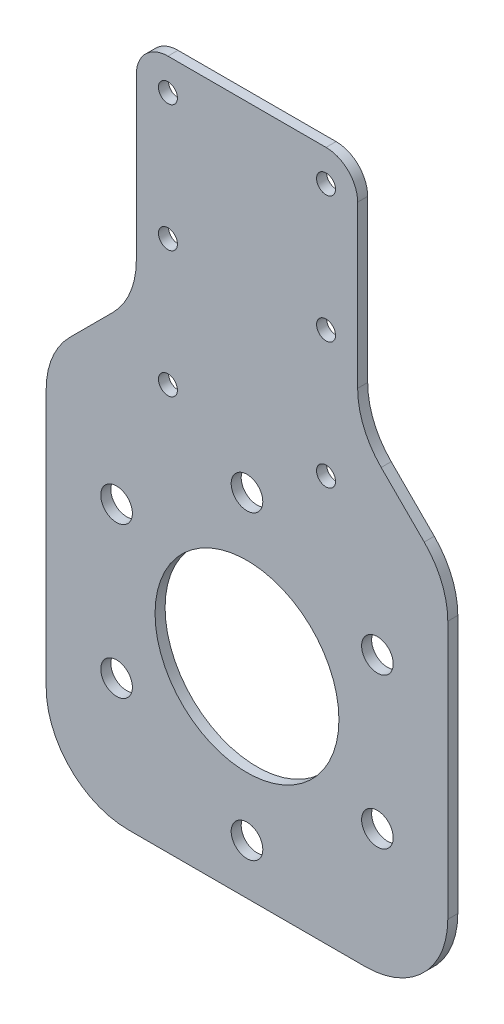
ISO-10303-21;
HEADER;
FILE_DESCRIPTION(('STEP AP214'),'2;1');
FILE_NAME('part.step','',(''),(''),'','','');
FILE_SCHEMA(('AUTOMOTIVE_DESIGN { 1 0 10303 214 1 1 1 1 }'));
ENDSEC;
DATA;
#1=APPLICATION_CONTEXT('core data for automotive mechanical design processes');
#2=APPLICATION_PROTOCOL_DEFINITION('international standard','automotive_design',2000,#1);
#3=PRODUCT_CONTEXT('',#1,'mechanical');
#4=PRODUCT('Part','Part','',(#3));
#5=PRODUCT_RELATED_PRODUCT_CATEGORY('part','',(#4));
#6=PRODUCT_DEFINITION_FORMATION('','',#4);
#7=PRODUCT_DEFINITION_CONTEXT('part definition',#1,'design');
#8=PRODUCT_DEFINITION('design','',#6,#7);
#9=PRODUCT_DEFINITION_SHAPE('','',#8);
#10=(LENGTH_UNIT() NAMED_UNIT(*) SI_UNIT(.MILLI.,.METRE.));
#11=(NAMED_UNIT(*) PLANE_ANGLE_UNIT() SI_UNIT($,.RADIAN.));
#12=(NAMED_UNIT(*) SI_UNIT($,.STERADIAN.) SOLID_ANGLE_UNIT());
#13=UNCERTAINTY_MEASURE_WITH_UNIT(LENGTH_MEASURE(1.E-05),#10,'distance_accuracy_value','');
#14=(GEOMETRIC_REPRESENTATION_CONTEXT(3) GLOBAL_UNCERTAINTY_ASSIGNED_CONTEXT((#13)) GLOBAL_UNIT_ASSIGNED_CONTEXT((#10,
#11,#12)) REPRESENTATION_CONTEXT('',''));
#15=CARTESIAN_POINT('',(0.,0.,0.));
#16=DIRECTION('',(0.,0.,1.));
#17=DIRECTION('',(1.,0.,0.));
#18=AXIS2_PLACEMENT_3D('',#15,#16,#17);
#19=CARTESIAN_POINT('',(0.,0.,1.5875));
#20=DIRECTION('',(0.,0.,1.));
#21=DIRECTION('',(1.,0.,0.));
#22=AXIS2_PLACEMENT_3D('',#19,#20,#21);
#23=PLANE('',#22);
#24=CARTESIAN_POINT('',(52.3722299276169,-15.4307500000005,1.5875));
#25=DIRECTION('',(0.,0.,1.));
#26=DIRECTION('',(1.,0.,0.));
#27=AXIS2_PLACEMENT_3D('',#24,#25,#26);
#28=CIRCLE('',#27,2.5);
#29=CARTESIAN_POINT('',(54.8722299276169,-15.4307500000005,1.5875));
#30=VERTEX_POINT('',#29);
#31=EDGE_CURVE('E424',#30,#30,#28,.T.);
#32=ORIENTED_EDGE('',*,*,#31,.F.);
#33=EDGE_LOOP('',(#32));
#34=FACE_BOUND('',#33,.T.);
#35=CARTESIAN_POINT('',(11.1277700723835,-15.4307500000003,1.5875));
#36=DIRECTION('',(0.,0.,1.));
#37=DIRECTION('',(1.,0.,0.));
#38=AXIS2_PLACEMENT_3D('',#35,#36,#37);
#39=CIRCLE('',#38,2.5);
#40=CARTESIAN_POINT('',(13.6277700723835,-15.4307500000003,1.5875));
#41=VERTEX_POINT('',#40);
#42=EDGE_CURVE('E408',#41,#41,#39,.T.);
#43=ORIENTED_EDGE('',*,*,#42,.F.);
#44=EDGE_LOOP('',(#43));
#45=FACE_BOUND('',#44,.T.);
#46=CARTESIAN_POINT('',(44.25,45.,1.5875));
#47=DIRECTION('',(0.,0.,1.));
#48=DIRECTION('',(-1.,0.,0.));
#49=AXIS2_PLACEMENT_3D('',#46,#47,#48);
#50=CIRCLE('',#49,1.5);
#51=CARTESIAN_POINT('',(42.75,45.,1.5875));
#52=VERTEX_POINT('',#51);
#53=EDGE_CURVE('E392',#52,#52,#50,.T.);
#54=ORIENTED_EDGE('',*,*,#53,.F.);
#55=EDGE_LOOP('',(#54));
#56=FACE_BOUND('',#55,.T.);
#57=CARTESIAN_POINT('',(44.25,5.,1.5875));
#58=DIRECTION('',(0.,0.,1.));
#59=DIRECTION('',(-1.,0.,0.));
#60=AXIS2_PLACEMENT_3D('',#57,#58,#59);
#61=CIRCLE('',#60,1.50000000000001);
#62=CARTESIAN_POINT('',(42.75,5.,1.5875));
#63=VERTEX_POINT('',#62);
#64=EDGE_CURVE('E376',#63,#63,#61,.T.);
#65=ORIENTED_EDGE('',*,*,#64,.F.);
#66=EDGE_LOOP('',(#65));
#67=FACE_BOUND('',#66,.T.);
#68=CARTESIAN_POINT('',(19.25,25.,1.5875));
#69=DIRECTION('',(0.,0.,1.));
#70=DIRECTION('',(1.,0.,0.));
#71=AXIS2_PLACEMENT_3D('',#68,#69,#70);
#72=CIRCLE('',#71,1.5);
#73=CARTESIAN_POINT('',(20.75,25.,1.5875));
#74=VERTEX_POINT('',#73);
#75=EDGE_CURVE('E360',#74,#74,#72,.T.);
#76=ORIENTED_EDGE('',*,*,#75,.F.);
#77=EDGE_LOOP('',(#76));
#78=FACE_BOUND('',#77,.T.);
#79=CARTESIAN_POINT('',(31.75,-27.337,1.5875));
#80=DIRECTION('',(0.,0.,1.));
#81=DIRECTION('',(1.,0.,0.));
#82=AXIS2_PLACEMENT_3D('',#79,#80,#81);
#83=CIRCLE('',#82,14.5375);
#84=CARTESIAN_POINT('',(46.2875,-27.337,1.5875));
#85=VERTEX_POINT('',#84);
#86=EDGE_CURVE('E344',#85,#85,#83,.T.);
#87=ORIENTED_EDGE('',*,*,#86,.F.);
#88=EDGE_LOOP('',(#87));
#89=FACE_BOUND('',#88,.T.);
#90=DIRECTION('',(0.707106781186551,0.707106781186544,0.));
#91=VECTOR('',#90,1.);
#92=CARTESIAN_POINT('',(5.19999147907679E-08,0.,1.5875));
#93=LINE('',#92,#91);
#94=CARTESIAN_POINT('',(10.5302561210691,10.5302560690691,1.5875));
#95=VERTEX_POINT('',#94);
#96=CARTESIAN_POINT('',(3.71974387893089,3.71974382693094,1.5875));
#97=VERTEX_POINT('',#96);
#98=EDGE_CURVE('E253',#95,#97,#93,.F.);
#99=ORIENTED_EDGE('',*,*,#98,.T.);
#100=CARTESIAN_POINT('',(12.7,-5.26051229413826,1.5875));
#101=DIRECTION('',(0.,0.,1.));
#102=DIRECTION('',(1.,0.,0.));
#103=AXIS2_PLACEMENT_3D('',#100,#101,#102);
#104=CIRCLE('',#103,12.7);
#105=CARTESIAN_POINT('',(0.,-5.26051229413826,1.5875));
#106=VERTEX_POINT('',#105);
#107=EDGE_CURVE('E279',#97,#106,#104,.T.);
#108=ORIENTED_EDGE('',*,*,#107,.T.);
#109=DIRECTION('',(0.,-1.,0.));
#110=VECTOR('',#109,1.);
#111=CARTESIAN_POINT('',(0.,0.,1.5875));
#112=LINE('',#111,#110);
#113=CARTESIAN_POINT('',(0.,-46.087,1.5875));
#114=VERTEX_POINT('',#113);
#115=EDGE_CURVE('E186',#106,#114,#112,.T.);
#116=ORIENTED_EDGE('',*,*,#115,.T.);
#117=CARTESIAN_POINT('',(13.,-46.087,1.5875));
#118=DIRECTION('',(0.,0.,1.));
#119=DIRECTION('',(1.,0.,0.));
#120=AXIS2_PLACEMENT_3D('',#117,#118,#119);
#121=CIRCLE('',#120,13.);
#122=CARTESIAN_POINT('',(13.,-59.087,1.5875));
#123=VERTEX_POINT('',#122);
#124=EDGE_CURVE('E233',#114,#123,#121,.T.);
#125=ORIENTED_EDGE('',*,*,#124,.T.);
#126=DIRECTION('',(1.,0.,0.));
#127=VECTOR('',#126,1.);
#128=CARTESIAN_POINT('',(0.,-59.087,1.5875));
#129=LINE('',#128,#127);
#130=CARTESIAN_POINT('',(50.5,-59.087,1.5875));
#131=VERTEX_POINT('',#130);
#132=EDGE_CURVE('E191',#123,#131,#129,.T.);
#133=ORIENTED_EDGE('',*,*,#132,.T.);
#134=CARTESIAN_POINT('',(50.5,-46.087,1.5875));
#135=DIRECTION('',(0.,0.,1.));
#136=DIRECTION('',(1.,0.,0.));
#137=AXIS2_PLACEMENT_3D('',#134,#135,#136);
#138=CIRCLE('',#137,13.);
#139=CARTESIAN_POINT('',(63.5,-46.087,1.5875));
#140=VERTEX_POINT('',#139);
#141=EDGE_CURVE('E236',#131,#140,#138,.T.);
#142=ORIENTED_EDGE('',*,*,#141,.T.);
#143=DIRECTION('',(0.,1.,0.));
#144=VECTOR('',#143,1.);
#145=CARTESIAN_POINT('',(63.5,-59.087,1.5875));
#146=LINE('',#145,#144);
#147=CARTESIAN_POINT('',(63.5,-5.26051229413828,1.5875));
#148=VERTEX_POINT('',#147);
#149=EDGE_CURVE('E313',#140,#148,#146,.T.);
#150=ORIENTED_EDGE('',*,*,#149,.T.);
#151=CARTESIAN_POINT('',(50.8,-5.26051229413829,1.5875));
#152=DIRECTION('',(0.,0.,1.));
#153=DIRECTION('',(1.,0.,0.));
#154=AXIS2_PLACEMENT_3D('',#151,#152,#153);
#155=CIRCLE('',#154,12.7);
#156=CARTESIAN_POINT('',(59.7802561210692,3.71974382693082,1.5875));
#157=VERTEX_POINT('',#156);
#158=EDGE_CURVE('E276',#148,#157,#155,.T.);
#159=ORIENTED_EDGE('',*,*,#158,.T.);
#160=DIRECTION('',(0.707106781186544,-0.707106781186551,0.));
#161=VECTOR('',#160,1.);
#162=CARTESIAN_POINT('',(49.25,14.2499999480001,1.5875));
#163=LINE('',#162,#161);
#164=CARTESIAN_POINT('',(52.9697438789308,10.5302560690693,1.5875));
#165=VERTEX_POINT('',#164);
#166=EDGE_CURVE('E247',#157,#165,#163,.F.);
#167=ORIENTED_EDGE('',*,*,#166,.T.);
#168=CARTESIAN_POINT('',(61.95,19.5105121901384,1.5875));
#169=DIRECTION('',(0.,0.,1.));
#170=DIRECTION('',(1.,0.,0.));
#171=AXIS2_PLACEMENT_3D('',#168,#169,#170);
#172=CIRCLE('',#171,12.7);
#173=CARTESIAN_POINT('',(49.25,19.5105121901384,1.5875));
#174=VERTEX_POINT('',#173);
#175=EDGE_CURVE('E11',#165,#174,#172,.F.);
#176=ORIENTED_EDGE('',*,*,#175,.T.);
#177=DIRECTION('',(0.,1.,0.));
#178=VECTOR('',#177,1.);
#179=CARTESIAN_POINT('',(49.25,0.,1.5875));
#180=LINE('',#179,#178);
#181=CARTESIAN_POINT('',(49.25,45.,1.5875));
#182=VERTEX_POINT('',#181);
#183=EDGE_CURVE('E308',#174,#182,#180,.T.);
#184=ORIENTED_EDGE('',*,*,#183,.T.);
#185=CARTESIAN_POINT('',(44.25,45.,1.5875));
#186=DIRECTION('',(0.,0.,1.));
#187=DIRECTION('',(1.,0.,0.));
#188=AXIS2_PLACEMENT_3D('',#185,#186,#187);
#189=CIRCLE('',#188,5.);
#190=CARTESIAN_POINT('',(44.25,50.,1.5875));
#191=VERTEX_POINT('',#190);
#192=EDGE_CURVE('E205',#182,#191,#189,.T.);
#193=ORIENTED_EDGE('',*,*,#192,.T.);
#194=DIRECTION('',(-1.,0.,0.));
#195=VECTOR('',#194,1.);
#196=CARTESIAN_POINT('',(14.25,50.,1.5875));
#197=LINE('',#196,#195);
#198=CARTESIAN_POINT('',(19.25,50.,1.5875));
#199=VERTEX_POINT('',#198);
#200=EDGE_CURVE('E312',#191,#199,#197,.T.);
#201=ORIENTED_EDGE('',*,*,#200,.T.);
#202=CARTESIAN_POINT('',(19.25,45.,1.5875));
#203=DIRECTION('',(0.,0.,1.));
#204=DIRECTION('',(1.,0.,0.));
#205=AXIS2_PLACEMENT_3D('',#202,#203,#204);
#206=CIRCLE('',#205,5.);
#207=CARTESIAN_POINT('',(14.25,45.,1.5875));
#208=VERTEX_POINT('',#207);
#209=EDGE_CURVE('E208',#199,#208,#206,.T.);
#210=ORIENTED_EDGE('',*,*,#209,.T.);
#211=DIRECTION('',(0.,-1.,0.));
#212=VECTOR('',#211,1.);
#213=CARTESIAN_POINT('',(14.25,0.,1.5875));
#214=LINE('',#213,#212);
#215=CARTESIAN_POINT('',(14.25,19.5105121901383,1.5875));
#216=VERTEX_POINT('',#215);
#217=EDGE_CURVE('E176',#208,#216,#214,.T.);
#218=ORIENTED_EDGE('',*,*,#217,.T.);
#219=CARTESIAN_POINT('',(1.55,19.5105121901383,1.5875));
#220=DIRECTION('',(0.,0.,1.));
#221=DIRECTION('',(1.,0.,0.));
#222=AXIS2_PLACEMENT_3D('',#219,#220,#221);
#223=CIRCLE('',#222,12.7);
#224=EDGE_CURVE('E295',#216,#95,#223,.F.);
#225=ORIENTED_EDGE('',*,*,#224,.T.);
#226=EDGE_LOOP('',(#99,#108,#116,#125,#133,#142,#150,#159,#167,#176,#184,#193,#201,#210,#218,#225));
#227=FACE_BOUND('',#226,.T.);
#228=CARTESIAN_POINT('',(31.75,-51.1495,1.5875));
#229=DIRECTION('',(0.,0.,1.));
#230=DIRECTION('',(1.,0.,0.));
#231=AXIS2_PLACEMENT_3D('',#228,#229,#230);
#232=CIRCLE('',#231,2.5);
#233=CARTESIAN_POINT('',(34.25,-51.1495,1.5875));
#234=VERTEX_POINT('',#233);
#235=EDGE_CURVE('E329',#234,#234,#232,.T.);
#236=ORIENTED_EDGE('',*,*,#235,.F.);
#237=EDGE_LOOP('',(#236));
#238=FACE_BOUND('',#237,.T.);
#239=CARTESIAN_POINT('',(19.25,45.,1.5875));
#240=DIRECTION('',(0.,0.,1.));
#241=DIRECTION('',(1.,0.,0.));
#242=AXIS2_PLACEMENT_3D('',#239,#240,#241);
#243=CIRCLE('',#242,1.5);
#244=CARTESIAN_POINT('',(20.75,45.,1.5875));
#245=VERTEX_POINT('',#244);
#246=EDGE_CURVE('E352',#245,#245,#243,.T.);
#247=ORIENTED_EDGE('',*,*,#246,.F.);
#248=EDGE_LOOP('',(#247));
#249=FACE_BOUND('',#248,.T.);
#250=CARTESIAN_POINT('',(19.25,5.,1.5875));
#251=DIRECTION('',(0.,0.,1.));
#252=DIRECTION('',(1.,0.,0.));
#253=AXIS2_PLACEMENT_3D('',#250,#251,#252);
#254=CIRCLE('',#253,1.5);
#255=CARTESIAN_POINT('',(20.75,5.,1.5875));
#256=VERTEX_POINT('',#255);
#257=EDGE_CURVE('E368',#256,#256,#254,.T.);
#258=ORIENTED_EDGE('',*,*,#257,.F.);
#259=EDGE_LOOP('',(#258));
#260=FACE_BOUND('',#259,.T.);
#261=CARTESIAN_POINT('',(44.25,25.,1.5875));
#262=DIRECTION('',(0.,0.,1.));
#263=DIRECTION('',(-1.,0.,0.));
#264=AXIS2_PLACEMENT_3D('',#261,#262,#263);
#265=CIRCLE('',#264,1.5);
#266=CARTESIAN_POINT('',(42.75,25.,1.5875));
#267=VERTEX_POINT('',#266);
#268=EDGE_CURVE('E384',#267,#267,#265,.T.);
#269=ORIENTED_EDGE('',*,*,#268,.F.);
#270=EDGE_LOOP('',(#269));
#271=FACE_BOUND('',#270,.T.);
#272=CARTESIAN_POINT('',(11.1277700723834,-39.24325,1.5875));
#273=DIRECTION('',(0.,0.,1.));
#274=DIRECTION('',(1.,0.,0.));
#275=AXIS2_PLACEMENT_3D('',#272,#273,#274);
#276=CIRCLE('',#275,2.5);
#277=CARTESIAN_POINT('',(13.6277700723834,-39.24325,1.5875));
#278=VERTEX_POINT('',#277);
#279=EDGE_CURVE('E400',#278,#278,#276,.T.);
#280=ORIENTED_EDGE('',*,*,#279,.F.);
#281=EDGE_LOOP('',(#280));
#282=FACE_BOUND('',#281,.T.);
#283=CARTESIAN_POINT('',(31.7500000000003,-3.52450000000051,1.5875));
#284=DIRECTION('',(0.,0.,1.));
#285=DIRECTION('',(1.,0.,0.));
#286=AXIS2_PLACEMENT_3D('',#283,#284,#285);
#287=CIRCLE('',#286,2.5);
#288=CARTESIAN_POINT('',(34.2500000000003,-3.52450000000051,1.5875));
#289=VERTEX_POINT('',#288);
#290=EDGE_CURVE('E416',#289,#289,#287,.T.);
#291=ORIENTED_EDGE('',*,*,#290,.F.);
#292=EDGE_LOOP('',(#291));
#293=FACE_BOUND('',#292,.T.);
#294=CARTESIAN_POINT('',(52.3722299276168,-39.2432500000002,1.5875));
#295=DIRECTION('',(0.,0.,1.));
#296=DIRECTION('',(1.,0.,0.));
#297=AXIS2_PLACEMENT_3D('',#294,#295,#296);
#298=CIRCLE('',#297,2.50000000000001);
#299=CARTESIAN_POINT('',(54.8722299276168,-39.2432500000002,1.5875));
#300=VERTEX_POINT('',#299);
#301=EDGE_CURVE('E432',#300,#300,#298,.T.);
#302=ORIENTED_EDGE('',*,*,#301,.F.);
#303=EDGE_LOOP('',(#302));
#304=FACE_BOUND('',#303,.T.);
#305=ADVANCED_FACE('F40',(#34,#45,#56,#67,#78,#89,#227,#238,#249,#260,#271,#282,#293,#304),#23,.T.);
#306=CARTESIAN_POINT('',(0.,0.,0.));
#307=DIRECTION('',(0.,0.,1.));
#308=DIRECTION('',(1.,0.,0.));
#309=AXIS2_PLACEMENT_3D('',#306,#307,#308);
#310=PLANE('',#309);
#311=DIRECTION('',(0.,-1.,0.));
#312=VECTOR('',#311,1.);
#313=CARTESIAN_POINT('',(0.,0.,0.));
#314=LINE('',#313,#312);
#315=CARTESIAN_POINT('',(0.,-5.26051229413826,0.));
#316=VERTEX_POINT('',#315);
#317=CARTESIAN_POINT('',(0.,-46.087,0.));
#318=VERTEX_POINT('',#317);
#319=EDGE_CURVE('E325',#316,#318,#314,.T.);
#320=ORIENTED_EDGE('',*,*,#319,.F.);
#321=CARTESIAN_POINT('',(12.7,-5.26051229413826,0.));
#322=DIRECTION('',(0.,0.,1.));
#323=DIRECTION('',(1.,0.,0.));
#324=AXIS2_PLACEMENT_3D('',#321,#322,#323);
#325=CIRCLE('',#324,12.7);
#326=CARTESIAN_POINT('',(3.71974387893089,3.71974382693094,0.));
#327=VERTEX_POINT('',#326);
#328=EDGE_CURVE('E273',#316,#327,#325,.F.);
#329=ORIENTED_EDGE('',*,*,#328,.T.);
#330=DIRECTION('',(-0.707106781186551,-0.707106781186544,0.));
#331=VECTOR('',#330,1.);
#332=CARTESIAN_POINT('',(2.59999573953837E-08,-2.5999957395384E-08,0.));
#333=LINE('',#332,#331);
#334=CARTESIAN_POINT('',(10.5302561210691,10.5302560690691,0.));
#335=VERTEX_POINT('',#334);
#336=EDGE_CURVE('E250',#327,#335,#333,.F.);
#337=ORIENTED_EDGE('',*,*,#336,.T.);
#338=CARTESIAN_POINT('',(1.55,19.5105121901383,0.));
#339=DIRECTION('',(0.,0.,1.));
#340=DIRECTION('',(1.,0.,0.));
#341=AXIS2_PLACEMENT_3D('',#338,#339,#340);
#342=CIRCLE('',#341,12.7);
#343=CARTESIAN_POINT('',(14.25,19.5105121901383,0.));
#344=VERTEX_POINT('',#343);
#345=EDGE_CURVE('E184',#335,#344,#342,.T.);
#346=ORIENTED_EDGE('',*,*,#345,.T.);
#347=DIRECTION('',(0.,-1.,0.));
#348=VECTOR('',#347,1.);
#349=CARTESIAN_POINT('',(14.25,0.,0.));
#350=LINE('',#349,#348);
#351=CARTESIAN_POINT('',(14.25,45.,0.));
#352=VERTEX_POINT('',#351);
#353=EDGE_CURVE('E173',#352,#344,#350,.T.);
#354=ORIENTED_EDGE('',*,*,#353,.F.);
#355=CARTESIAN_POINT('',(19.25,45.,0.));
#356=DIRECTION('',(0.,0.,1.));
#357=DIRECTION('',(1.,0.,0.));
#358=AXIS2_PLACEMENT_3D('',#355,#356,#357);
#359=CIRCLE('',#358,5.);
#360=CARTESIAN_POINT('',(19.25,50.,0.));
#361=VERTEX_POINT('',#360);
#362=EDGE_CURVE('E154',#352,#361,#359,.F.);
#363=ORIENTED_EDGE('',*,*,#362,.T.);
#364=DIRECTION('',(-1.,0.,0.));
#365=VECTOR('',#364,1.);
#366=CARTESIAN_POINT('',(14.25,50.,0.));
#367=LINE('',#366,#365);
#368=CARTESIAN_POINT('',(44.25,50.,0.));
#369=VERTEX_POINT('',#368);
#370=EDGE_CURVE('E187',#369,#361,#367,.T.);
#371=ORIENTED_EDGE('',*,*,#370,.F.);
#372=CARTESIAN_POINT('',(44.25,45.,0.));
#373=DIRECTION('',(0.,0.,1.));
#374=DIRECTION('',(1.,0.,0.));
#375=AXIS2_PLACEMENT_3D('',#372,#373,#374);
#376=CIRCLE('',#375,5.);
#377=CARTESIAN_POINT('',(49.25,45.,0.));
#378=VERTEX_POINT('',#377);
#379=EDGE_CURVE('E166',#369,#378,#376,.F.);
#380=ORIENTED_EDGE('',*,*,#379,.T.);
#381=DIRECTION('',(0.,1.,0.));
#382=VECTOR('',#381,1.);
#383=CARTESIAN_POINT('',(49.25,0.,0.));
#384=LINE('',#383,#382);
#385=CARTESIAN_POINT('',(49.25,19.5105121901384,0.));
#386=VERTEX_POINT('',#385);
#387=EDGE_CURVE('E193',#386,#378,#384,.T.);
#388=ORIENTED_EDGE('',*,*,#387,.F.);
#389=CARTESIAN_POINT('',(61.95,19.5105121901384,0.));
#390=DIRECTION('',(0.,0.,1.));
#391=DIRECTION('',(1.,0.,0.));
#392=AXIS2_PLACEMENT_3D('',#389,#390,#391);
#393=CIRCLE('',#392,12.7);
#394=CARTESIAN_POINT('',(52.9697438789308,10.5302560690693,0.));
#395=VERTEX_POINT('',#394);
#396=EDGE_CURVE('E49',#386,#395,#393,.T.);
#397=ORIENTED_EDGE('',*,*,#396,.T.);
#398=DIRECTION('',(-0.707106781186544,0.707106781186551,0.));
#399=VECTOR('',#398,1.);
#400=CARTESIAN_POINT('',(31.7499999740003,31.749999974,0.));
#401=LINE('',#400,#399);
#402=CARTESIAN_POINT('',(59.7802561210692,3.71974382693082,0.));
#403=VERTEX_POINT('',#402);
#404=EDGE_CURVE('E243',#395,#403,#401,.F.);
#405=ORIENTED_EDGE('',*,*,#404,.T.);
#406=CARTESIAN_POINT('',(50.8,-5.26051229413829,0.));
#407=DIRECTION('',(0.,0.,1.));
#408=DIRECTION('',(1.,0.,0.));
#409=AXIS2_PLACEMENT_3D('',#406,#407,#408);
#410=CIRCLE('',#409,12.7);
#411=CARTESIAN_POINT('',(63.5,-5.26051229413828,0.));
#412=VERTEX_POINT('',#411);
#413=EDGE_CURVE('E270',#403,#412,#410,.F.);
#414=ORIENTED_EDGE('',*,*,#413,.T.);
#415=DIRECTION('',(0.,1.,0.));
#416=VECTOR('',#415,1.);
#417=CARTESIAN_POINT('',(63.5,-59.087,0.));
#418=LINE('',#417,#416);
#419=CARTESIAN_POINT('',(63.5,-46.087,0.));
#420=VERTEX_POINT('',#419);
#421=EDGE_CURVE('E333',#420,#412,#418,.T.);
#422=ORIENTED_EDGE('',*,*,#421,.F.);
#423=CARTESIAN_POINT('',(50.5,-46.087,0.));
#424=DIRECTION('',(0.,0.,1.));
#425=DIRECTION('',(1.,0.,0.));
#426=AXIS2_PLACEMENT_3D('',#423,#424,#425);
#427=CIRCLE('',#426,13.);
#428=CARTESIAN_POINT('',(50.5,-59.087,0.));
#429=VERTEX_POINT('',#428);
#430=EDGE_CURVE('E223',#420,#429,#427,.F.);
#431=ORIENTED_EDGE('',*,*,#430,.T.);
#432=DIRECTION('',(1.,0.,0.));
#433=VECTOR('',#432,1.);
#434=CARTESIAN_POINT('',(0.,-59.087,0.));
#435=LINE('',#434,#433);
#436=CARTESIAN_POINT('',(13.,-59.087,0.));
#437=VERTEX_POINT('',#436);
#438=EDGE_CURVE('E328',#437,#429,#435,.T.);
#439=ORIENTED_EDGE('',*,*,#438,.F.);
#440=CARTESIAN_POINT('',(13.,-46.087,0.));
#441=DIRECTION('',(0.,0.,1.));
#442=DIRECTION('',(1.,0.,0.));
#443=AXIS2_PLACEMENT_3D('',#440,#441,#442);
#444=CIRCLE('',#443,13.);
#445=EDGE_CURVE('E219',#437,#318,#444,.F.);
#446=ORIENTED_EDGE('',*,*,#445,.T.);
#447=EDGE_LOOP('',(#320,#329,#337,#346,#354,#363,#371,#380,#388,#397,#405,#414,#422,#431,#439,#446));
#448=FACE_BOUND('',#447,.T.);
#449=CARTESIAN_POINT('',(31.75,-51.1495,0.));
#450=DIRECTION('',(0.,0.,1.));
#451=DIRECTION('',(1.,0.,0.));
#452=AXIS2_PLACEMENT_3D('',#449,#450,#451);
#453=CIRCLE('',#452,2.5);
#454=CARTESIAN_POINT('',(34.25,-51.1495,0.));
#455=VERTEX_POINT('',#454);
#456=EDGE_CURVE('E340',#455,#455,#453,.T.);
#457=ORIENTED_EDGE('',*,*,#456,.T.);
#458=EDGE_LOOP('',(#457));
#459=FACE_BOUND('',#458,.T.);
#460=CARTESIAN_POINT('',(31.75,-27.337,0.));
#461=DIRECTION('',(0.,0.,1.));
#462=DIRECTION('',(1.,0.,0.));
#463=AXIS2_PLACEMENT_3D('',#460,#461,#462);
#464=CIRCLE('',#463,14.5375);
#465=CARTESIAN_POINT('',(46.2875,-27.337,0.));
#466=VERTEX_POINT('',#465);
#467=EDGE_CURVE('E348',#466,#466,#464,.T.);
#468=ORIENTED_EDGE('',*,*,#467,.T.);
#469=EDGE_LOOP('',(#468));
#470=FACE_BOUND('',#469,.T.);
#471=CARTESIAN_POINT('',(19.25,45.,0.));
#472=DIRECTION('',(0.,0.,1.));
#473=DIRECTION('',(1.,0.,0.));
#474=AXIS2_PLACEMENT_3D('',#471,#472,#473);
#475=CIRCLE('',#474,1.5);
#476=CARTESIAN_POINT('',(20.75,45.,0.));
#477=VERTEX_POINT('',#476);
#478=EDGE_CURVE('E356',#477,#477,#475,.T.);
#479=ORIENTED_EDGE('',*,*,#478,.T.);
#480=EDGE_LOOP('',(#479));
#481=FACE_BOUND('',#480,.T.);
#482=CARTESIAN_POINT('',(19.25,25.,0.));
#483=DIRECTION('',(0.,0.,1.));
#484=DIRECTION('',(1.,0.,0.));
#485=AXIS2_PLACEMENT_3D('',#482,#483,#484);
#486=CIRCLE('',#485,1.5);
#487=CARTESIAN_POINT('',(20.75,25.,0.));
#488=VERTEX_POINT('',#487);
#489=EDGE_CURVE('E364',#488,#488,#486,.T.);
#490=ORIENTED_EDGE('',*,*,#489,.T.);
#491=EDGE_LOOP('',(#490));
#492=FACE_BOUND('',#491,.T.);
#493=CARTESIAN_POINT('',(19.25,5.,0.));
#494=DIRECTION('',(0.,0.,1.));
#495=DIRECTION('',(1.,0.,0.));
#496=AXIS2_PLACEMENT_3D('',#493,#494,#495);
#497=CIRCLE('',#496,1.5);
#498=CARTESIAN_POINT('',(20.75,5.,0.));
#499=VERTEX_POINT('',#498);
#500=EDGE_CURVE('E372',#499,#499,#497,.T.);
#501=ORIENTED_EDGE('',*,*,#500,.T.);
#502=EDGE_LOOP('',(#501));
#503=FACE_BOUND('',#502,.T.);
#504=CARTESIAN_POINT('',(44.25,5.,0.));
#505=DIRECTION('',(0.,0.,1.));
#506=DIRECTION('',(-1.,0.,0.));
#507=AXIS2_PLACEMENT_3D('',#504,#505,#506);
#508=CIRCLE('',#507,1.50000000000001);
#509=CARTESIAN_POINT('',(42.75,5.,0.));
#510=VERTEX_POINT('',#509);
#511=EDGE_CURVE('E380',#510,#510,#508,.T.);
#512=ORIENTED_EDGE('',*,*,#511,.T.);
#513=EDGE_LOOP('',(#512));
#514=FACE_BOUND('',#513,.T.);
#515=CARTESIAN_POINT('',(44.25,25.,0.));
#516=DIRECTION('',(0.,0.,1.));
#517=DIRECTION('',(-1.,0.,0.));
#518=AXIS2_PLACEMENT_3D('',#515,#516,#517);
#519=CIRCLE('',#518,1.5);
#520=CARTESIAN_POINT('',(42.75,25.,0.));
#521=VERTEX_POINT('',#520);
#522=EDGE_CURVE('E388',#521,#521,#519,.T.);
#523=ORIENTED_EDGE('',*,*,#522,.T.);
#524=EDGE_LOOP('',(#523));
#525=FACE_BOUND('',#524,.T.);
#526=CARTESIAN_POINT('',(44.25,45.,0.));
#527=DIRECTION('',(0.,0.,1.));
#528=DIRECTION('',(-1.,0.,0.));
#529=AXIS2_PLACEMENT_3D('',#526,#527,#528);
#530=CIRCLE('',#529,1.5);
#531=CARTESIAN_POINT('',(42.75,45.,0.));
#532=VERTEX_POINT('',#531);
#533=EDGE_CURVE('E396',#532,#532,#530,.T.);
#534=ORIENTED_EDGE('',*,*,#533,.T.);
#535=EDGE_LOOP('',(#534));
#536=FACE_BOUND('',#535,.T.);
#537=CARTESIAN_POINT('',(11.1277700723834,-39.24325,0.));
#538=DIRECTION('',(0.,0.,1.));
#539=DIRECTION('',(1.,0.,0.));
#540=AXIS2_PLACEMENT_3D('',#537,#538,#539);
#541=CIRCLE('',#540,2.5);
#542=CARTESIAN_POINT('',(13.6277700723834,-39.24325,0.));
#543=VERTEX_POINT('',#542);
#544=EDGE_CURVE('E404',#543,#543,#541,.T.);
#545=ORIENTED_EDGE('',*,*,#544,.T.);
#546=EDGE_LOOP('',(#545));
#547=FACE_BOUND('',#546,.T.);
#548=CARTESIAN_POINT('',(11.1277700723835,-15.4307500000003,0.));
#549=DIRECTION('',(0.,0.,1.));
#550=DIRECTION('',(1.,0.,0.));
#551=AXIS2_PLACEMENT_3D('',#548,#549,#550);
#552=CIRCLE('',#551,2.5);
#553=CARTESIAN_POINT('',(13.6277700723835,-15.4307500000003,0.));
#554=VERTEX_POINT('',#553);
#555=EDGE_CURVE('E412',#554,#554,#552,.T.);
#556=ORIENTED_EDGE('',*,*,#555,.T.);
#557=EDGE_LOOP('',(#556));
#558=FACE_BOUND('',#557,.T.);
#559=CARTESIAN_POINT('',(31.7500000000003,-3.52450000000051,0.));
#560=DIRECTION('',(0.,0.,1.));
#561=DIRECTION('',(1.,0.,0.));
#562=AXIS2_PLACEMENT_3D('',#559,#560,#561);
#563=CIRCLE('',#562,2.5);
#564=CARTESIAN_POINT('',(34.2500000000003,-3.52450000000051,0.));
#565=VERTEX_POINT('',#564);
#566=EDGE_CURVE('E420',#565,#565,#563,.T.);
#567=ORIENTED_EDGE('',*,*,#566,.T.);
#568=EDGE_LOOP('',(#567));
#569=FACE_BOUND('',#568,.T.);
#570=CARTESIAN_POINT('',(52.3722299276169,-15.4307500000005,0.));
#571=DIRECTION('',(0.,0.,1.));
#572=DIRECTION('',(1.,0.,0.));
#573=AXIS2_PLACEMENT_3D('',#570,#571,#572);
#574=CIRCLE('',#573,2.5);
#575=CARTESIAN_POINT('',(54.8722299276169,-15.4307500000005,0.));
#576=VERTEX_POINT('',#575);
#577=EDGE_CURVE('E428',#576,#576,#574,.T.);
#578=ORIENTED_EDGE('',*,*,#577,.T.);
#579=EDGE_LOOP('',(#578));
#580=FACE_BOUND('',#579,.T.);
#581=CARTESIAN_POINT('',(52.3722299276168,-39.2432500000002,0.));
#582=DIRECTION('',(0.,0.,1.));
#583=DIRECTION('',(1.,0.,0.));
#584=AXIS2_PLACEMENT_3D('',#581,#582,#583);
#585=CIRCLE('',#584,2.50000000000001);
#586=CARTESIAN_POINT('',(54.8722299276168,-39.2432500000002,0.));
#587=VERTEX_POINT('',#586);
#588=EDGE_CURVE('E436',#587,#587,#585,.T.);
#589=ORIENTED_EDGE('',*,*,#588,.T.);
#590=EDGE_LOOP('',(#589));
#591=FACE_BOUND('',#590,.T.);
#592=ADVANCED_FACE('F180',(#448,#459,#470,#481,#492,#503,#514,#525,#536,#547,#558,#569,#580,
#591),#310,.F.);
#593=CARTESIAN_POINT('',(0.,0.,1.5875));
#594=DIRECTION('',(1.,0.,0.));
#595=DIRECTION('',(0.,1.,0.));
#596=AXIS2_PLACEMENT_3D('',#593,#594,#595);
#597=PLANE('',#596);
#598=ORIENTED_EDGE('',*,*,#115,.F.);
#599=DIRECTION('',(0.,0.,1.));
#600=VECTOR('',#599,1.);
#601=CARTESIAN_POINT('',(0.,-5.26051229413826,1.5875));
#602=LINE('',#601,#600);
#603=EDGE_CURVE('E266',#106,#316,#602,.F.);
#604=ORIENTED_EDGE('',*,*,#603,.T.);
#605=ORIENTED_EDGE('',*,*,#319,.T.);
#606=DIRECTION('',(0.,0.,-1.));
#607=VECTOR('',#606,1.);
#608=CARTESIAN_POINT('',(0.,-46.087,1.5875));
#609=LINE('',#608,#607);
#610=EDGE_CURVE('E239',#318,#114,#609,.F.);
#611=ORIENTED_EDGE('',*,*,#610,.T.);
#612=EDGE_LOOP('',(#598,#604,#605,#611));
#613=FACE_BOUND('',#612,.T.);
#614=ADVANCED_FACE('F474',(#613),#597,.F.);
#615=CARTESIAN_POINT('',(0.,-59.087,1.5875));
#616=DIRECTION('',(0.,1.,0.));
#617=DIRECTION('',(-1.,0.,0.));
#618=AXIS2_PLACEMENT_3D('',#615,#616,#617);
#619=PLANE('',#618);
#620=ORIENTED_EDGE('',*,*,#438,.T.);
#621=DIRECTION('',(0.,0.,-1.));
#622=VECTOR('',#621,1.);
#623=CARTESIAN_POINT('',(50.5,-59.087,1.5875));
#624=LINE('',#623,#622);
#625=EDGE_CURVE('E230',#429,#131,#624,.F.);
#626=ORIENTED_EDGE('',*,*,#625,.T.);
#627=ORIENTED_EDGE('',*,*,#132,.F.);
#628=DIRECTION('',(0.,0.,-1.));
#629=VECTOR('',#628,1.);
#630=CARTESIAN_POINT('',(13.,-59.087,1.5875));
#631=LINE('',#630,#629);
#632=EDGE_CURVE('E226',#123,#437,#631,.T.);
#633=ORIENTED_EDGE('',*,*,#632,.T.);
#634=EDGE_LOOP('',(#620,#626,#627,#633));
#635=FACE_BOUND('',#634,.T.);
#636=ADVANCED_FACE('F492',(#635),#619,.F.);
#637=CARTESIAN_POINT('',(63.5,-59.087,1.5875));
#638=DIRECTION('',(-1.,0.,0.));
#639=DIRECTION('',(0.,-1.,0.));
#640=AXIS2_PLACEMENT_3D('',#637,#638,#639);
#641=PLANE('',#640);
#642=ORIENTED_EDGE('',*,*,#421,.T.);
#643=DIRECTION('',(0.,0.,1.));
#644=VECTOR('',#643,1.);
#645=CARTESIAN_POINT('',(63.5,-5.26051229413828,1.5875));
#646=LINE('',#645,#644);
#647=EDGE_CURVE('E292',#412,#148,#646,.T.);
#648=ORIENTED_EDGE('',*,*,#647,.T.);
#649=ORIENTED_EDGE('',*,*,#149,.F.);
#650=DIRECTION('',(0.,0.,-1.));
#651=VECTOR('',#650,1.);
#652=CARTESIAN_POINT('',(63.5,-46.087,1.5875));
#653=LINE('',#652,#651);
#654=EDGE_CURVE('E215',#140,#420,#653,.T.);
#655=ORIENTED_EDGE('',*,*,#654,.T.);
#656=EDGE_LOOP('',(#642,#648,#649,#655));
#657=FACE_BOUND('',#656,.T.);
#658=ADVANCED_FACE('F457',(#657),#641,.F.);
#659=CARTESIAN_POINT('',(49.25,0.,1.5875));
#660=DIRECTION('',(-1.,0.,0.));
#661=DIRECTION('',(0.,-1.,0.));
#662=AXIS2_PLACEMENT_3D('',#659,#660,#661);
#663=PLANE('',#662);
#664=ORIENTED_EDGE('',*,*,#183,.F.);
#665=DIRECTION('',(0.,0.,1.));
#666=VECTOR('',#665,1.);
#667=CARTESIAN_POINT('',(49.25,19.5105121901384,0.));
#668=LINE('',#667,#666);
#669=EDGE_CURVE('E282',#174,#386,#668,.F.);
#670=ORIENTED_EDGE('',*,*,#669,.T.);
#671=ORIENTED_EDGE('',*,*,#387,.T.);
#672=DIRECTION('',(0.,0.,-1.));
#673=VECTOR('',#672,1.);
#674=CARTESIAN_POINT('',(49.25,45.,1.5875));
#675=LINE('',#674,#673);
#676=EDGE_CURVE('E211',#378,#182,#675,.F.);
#677=ORIENTED_EDGE('',*,*,#676,.T.);
#678=EDGE_LOOP('',(#664,#670,#671,#677));
#679=FACE_BOUND('',#678,.T.);
#680=ADVANCED_FACE('F307',(#679),#663,.F.);
#681=CARTESIAN_POINT('',(14.25,50.,1.5875));
#682=DIRECTION('',(0.,-1.,0.));
#683=DIRECTION('',(1.,0.,0.));
#684=AXIS2_PLACEMENT_3D('',#681,#682,#683);
#685=PLANE('',#684);
#686=ORIENTED_EDGE('',*,*,#370,.T.);
#687=DIRECTION('',(0.,0.,-1.));
#688=VECTOR('',#687,1.);
#689=CARTESIAN_POINT('',(19.25,50.,1.5875));
#690=LINE('',#689,#688);
#691=EDGE_CURVE('E159',#361,#199,#690,.F.);
#692=ORIENTED_EDGE('',*,*,#691,.T.);
#693=ORIENTED_EDGE('',*,*,#200,.F.);
#694=DIRECTION('',(0.,0.,-1.));
#695=VECTOR('',#694,1.);
#696=CARTESIAN_POINT('',(44.25,50.,1.5875));
#697=LINE('',#696,#695);
#698=EDGE_CURVE('E165',#191,#369,#697,.T.);
#699=ORIENTED_EDGE('',*,*,#698,.T.);
#700=EDGE_LOOP('',(#686,#692,#693,#699));
#701=FACE_BOUND('',#700,.T.);
#702=ADVANCED_FACE('F484',(#701),#685,.F.);
#703=CARTESIAN_POINT('',(14.25,0.,1.5875));
#704=DIRECTION('',(1.,0.,0.));
#705=DIRECTION('',(0.,1.,0.));
#706=AXIS2_PLACEMENT_3D('',#703,#704,#705);
#707=PLANE('',#706);
#708=ORIENTED_EDGE('',*,*,#353,.T.);
#709=DIRECTION('',(0.,0.,-1.));
#710=VECTOR('',#709,1.);
#711=CARTESIAN_POINT('',(14.25,19.5105121901383,1.5875));
#712=LINE('',#711,#710);
#713=EDGE_CURVE('E257',#344,#216,#712,.F.);
#714=ORIENTED_EDGE('',*,*,#713,.T.);
#715=ORIENTED_EDGE('',*,*,#217,.F.);
#716=DIRECTION('',(0.,0.,-1.));
#717=VECTOR('',#716,1.);
#718=CARTESIAN_POINT('',(14.25,45.,1.5875));
#719=LINE('',#718,#717);
#720=EDGE_CURVE('E158',#208,#352,#719,.T.);
#721=ORIENTED_EDGE('',*,*,#720,.T.);
#722=EDGE_LOOP('',(#708,#714,#715,#721));
#723=FACE_BOUND('',#722,.T.);
#724=ADVANCED_FACE('F171',(#723),#707,.F.);
#725=CARTESIAN_POINT('',(31.75,-51.1495,1.5875));
#726=DIRECTION('',(0.,0.,-1.));
#727=DIRECTION('',(-1.,0.,0.));
#728=AXIS2_PLACEMENT_3D('',#725,#726,#727);
#729=CYLINDRICAL_SURFACE('',#728,2.5);
#730=ORIENTED_EDGE('',*,*,#235,.T.);
#731=EDGE_LOOP('',(#730));
#732=FACE_BOUND('',#731,.T.);
#733=ORIENTED_EDGE('',*,*,#456,.F.);
#734=EDGE_LOOP('',(#733));
#735=FACE_BOUND('',#734,.T.);
#736=ADVANCED_FACE('F479',(#732,#735),#729,.F.);
#737=CARTESIAN_POINT('',(31.75,-27.337,1.5875));
#738=DIRECTION('',(0.,0.,-1.));
#739=DIRECTION('',(-1.,0.,0.));
#740=AXIS2_PLACEMENT_3D('',#737,#738,#739);
#741=CYLINDRICAL_SURFACE('',#740,14.5375);
#742=ORIENTED_EDGE('',*,*,#86,.T.);
#743=EDGE_LOOP('',(#742));
#744=FACE_BOUND('',#743,.T.);
#745=ORIENTED_EDGE('',*,*,#467,.F.);
#746=EDGE_LOOP('',(#745));
#747=FACE_BOUND('',#746,.T.);
#748=ADVANCED_FACE('F688',(#744,#747),#741,.F.);
#749=CARTESIAN_POINT('',(19.25,45.,1.5875));
#750=DIRECTION('',(0.,0.,-1.));
#751=DIRECTION('',(-1.,0.,0.));
#752=AXIS2_PLACEMENT_3D('',#749,#750,#751);
#753=CYLINDRICAL_SURFACE('',#752,1.5);
#754=ORIENTED_EDGE('',*,*,#246,.T.);
#755=EDGE_LOOP('',(#754));
#756=FACE_BOUND('',#755,.T.);
#757=ORIENTED_EDGE('',*,*,#478,.F.);
#758=EDGE_LOOP('',(#757));
#759=FACE_BOUND('',#758,.T.);
#760=ADVANCED_FACE('F679',(#756,#759),#753,.F.);
#761=CARTESIAN_POINT('',(19.25,25.,1.5875));
#762=DIRECTION('',(0.,0.,-1.));
#763=DIRECTION('',(-1.,0.,0.));
#764=AXIS2_PLACEMENT_3D('',#761,#762,#763);
#765=CYLINDRICAL_SURFACE('',#764,1.5);
#766=ORIENTED_EDGE('',*,*,#75,.T.);
#767=EDGE_LOOP('',(#766));
#768=FACE_BOUND('',#767,.T.);
#769=ORIENTED_EDGE('',*,*,#489,.F.);
#770=EDGE_LOOP('',(#769));
#771=FACE_BOUND('',#770,.T.);
#772=ADVANCED_FACE('F670',(#768,#771),#765,.F.);
#773=CARTESIAN_POINT('',(19.25,5.,1.5875));
#774=DIRECTION('',(0.,0.,-1.));
#775=DIRECTION('',(-1.,0.,0.));
#776=AXIS2_PLACEMENT_3D('',#773,#774,#775);
#777=CYLINDRICAL_SURFACE('',#776,1.5);
#778=ORIENTED_EDGE('',*,*,#257,.T.);
#779=EDGE_LOOP('',(#778));
#780=FACE_BOUND('',#779,.T.);
#781=ORIENTED_EDGE('',*,*,#500,.F.);
#782=EDGE_LOOP('',(#781));
#783=FACE_BOUND('',#782,.T.);
#784=ADVANCED_FACE('F661',(#780,#783),#777,.F.);
#785=CARTESIAN_POINT('',(44.25,5.,1.5875));
#786=DIRECTION('',(0.,0.,-1.));
#787=DIRECTION('',(-1.,0.,0.));
#788=AXIS2_PLACEMENT_3D('',#785,#786,#787);
#789=CYLINDRICAL_SURFACE('',#788,1.50000000000001);
#790=ORIENTED_EDGE('',*,*,#64,.T.);
#791=EDGE_LOOP('',(#790));
#792=FACE_BOUND('',#791,.T.);
#793=ORIENTED_EDGE('',*,*,#511,.F.);
#794=EDGE_LOOP('',(#793));
#795=FACE_BOUND('',#794,.T.);
#796=ADVANCED_FACE('F652',(#792,#795),#789,.F.);
#797=CARTESIAN_POINT('',(44.25,25.,1.5875));
#798=DIRECTION('',(0.,0.,-1.));
#799=DIRECTION('',(-1.,0.,0.));
#800=AXIS2_PLACEMENT_3D('',#797,#798,#799);
#801=CYLINDRICAL_SURFACE('',#800,1.5);
#802=ORIENTED_EDGE('',*,*,#268,.T.);
#803=EDGE_LOOP('',(#802));
#804=FACE_BOUND('',#803,.T.);
#805=ORIENTED_EDGE('',*,*,#522,.F.);
#806=EDGE_LOOP('',(#805));
#807=FACE_BOUND('',#806,.T.);
#808=ADVANCED_FACE('F643',(#804,#807),#801,.F.);
#809=CARTESIAN_POINT('',(44.25,45.,1.5875));
#810=DIRECTION('',(0.,0.,-1.));
#811=DIRECTION('',(-1.,0.,0.));
#812=AXIS2_PLACEMENT_3D('',#809,#810,#811);
#813=CYLINDRICAL_SURFACE('',#812,1.5);
#814=ORIENTED_EDGE('',*,*,#53,.T.);
#815=EDGE_LOOP('',(#814));
#816=FACE_BOUND('',#815,.T.);
#817=ORIENTED_EDGE('',*,*,#533,.F.);
#818=EDGE_LOOP('',(#817));
#819=FACE_BOUND('',#818,.T.);
#820=ADVANCED_FACE('F634',(#816,#819),#813,.F.);
#821=CARTESIAN_POINT('',(11.1277700723834,-39.24325,1.5875));
#822=DIRECTION('',(0.,0.,-1.));
#823=DIRECTION('',(-1.,0.,0.));
#824=AXIS2_PLACEMENT_3D('',#821,#822,#823);
#825=CYLINDRICAL_SURFACE('',#824,2.5);
#826=ORIENTED_EDGE('',*,*,#279,.T.);
#827=EDGE_LOOP('',(#826));
#828=FACE_BOUND('',#827,.T.);
#829=ORIENTED_EDGE('',*,*,#544,.F.);
#830=EDGE_LOOP('',(#829));
#831=FACE_BOUND('',#830,.T.);
#832=ADVANCED_FACE('F625',(#828,#831),#825,.F.);
#833=CARTESIAN_POINT('',(11.1277700723835,-15.4307500000003,1.5875));
#834=DIRECTION('',(0.,0.,-1.));
#835=DIRECTION('',(-1.,0.,0.));
#836=AXIS2_PLACEMENT_3D('',#833,#834,#835);
#837=CYLINDRICAL_SURFACE('',#836,2.5);
#838=ORIENTED_EDGE('',*,*,#42,.T.);
#839=EDGE_LOOP('',(#838));
#840=FACE_BOUND('',#839,.T.);
#841=ORIENTED_EDGE('',*,*,#555,.F.);
#842=EDGE_LOOP('',(#841));
#843=FACE_BOUND('',#842,.T.);
#844=ADVANCED_FACE('F616',(#840,#843),#837,.F.);
#845=CARTESIAN_POINT('',(31.7500000000003,-3.52450000000051,1.5875));
#846=DIRECTION('',(0.,0.,-1.));
#847=DIRECTION('',(-1.,0.,0.));
#848=AXIS2_PLACEMENT_3D('',#845,#846,#847);
#849=CYLINDRICAL_SURFACE('',#848,2.5);
#850=ORIENTED_EDGE('',*,*,#290,.T.);
#851=EDGE_LOOP('',(#850));
#852=FACE_BOUND('',#851,.T.);
#853=ORIENTED_EDGE('',*,*,#566,.F.);
#854=EDGE_LOOP('',(#853));
#855=FACE_BOUND('',#854,.T.);
#856=ADVANCED_FACE('F607',(#852,#855),#849,.F.);
#857=CARTESIAN_POINT('',(52.3722299276169,-15.4307500000005,1.5875));
#858=DIRECTION('',(0.,0.,-1.));
#859=DIRECTION('',(-1.,0.,0.));
#860=AXIS2_PLACEMENT_3D('',#857,#858,#859);
#861=CYLINDRICAL_SURFACE('',#860,2.5);
#862=ORIENTED_EDGE('',*,*,#31,.T.);
#863=EDGE_LOOP('',(#862));
#864=FACE_BOUND('',#863,.T.);
#865=ORIENTED_EDGE('',*,*,#577,.F.);
#866=EDGE_LOOP('',(#865));
#867=FACE_BOUND('',#866,.T.);
#868=ADVANCED_FACE('F598',(#864,#867),#861,.F.);
#869=CARTESIAN_POINT('',(52.3722299276168,-39.2432500000002,1.5875));
#870=DIRECTION('',(0.,0.,-1.));
#871=DIRECTION('',(-1.,0.,0.));
#872=AXIS2_PLACEMENT_3D('',#869,#870,#871);
#873=CYLINDRICAL_SURFACE('',#872,2.50000000000001);
#874=ORIENTED_EDGE('',*,*,#301,.T.);
#875=EDGE_LOOP('',(#874));
#876=FACE_BOUND('',#875,.T.);
#877=ORIENTED_EDGE('',*,*,#588,.F.);
#878=EDGE_LOOP('',(#877));
#879=FACE_BOUND('',#878,.T.);
#880=ADVANCED_FACE('F501',(#876,#879),#873,.F.);
#881=CARTESIAN_POINT('',(19.25,45.,1.5875));
#882=DIRECTION('',(0.,0.,-1.));
#883=DIRECTION('',(-1.,0.,0.));
#884=AXIS2_PLACEMENT_3D('',#881,#882,#883);
#885=CYLINDRICAL_SURFACE('',#884,5.);
#886=ORIENTED_EDGE('',*,*,#209,.F.);
#887=ORIENTED_EDGE('',*,*,#691,.F.);
#888=ORIENTED_EDGE('',*,*,#362,.F.);
#889=ORIENTED_EDGE('',*,*,#720,.F.);
#890=EDGE_LOOP('',(#886,#887,#888,#889));
#891=FACE_BOUND('',#890,.T.);
#892=ADVANCED_FACE('F157',(#891),#885,.T.);
#893=CARTESIAN_POINT('',(44.25,45.,1.5875));
#894=DIRECTION('',(0.,0.,-1.));
#895=DIRECTION('',(-1.,0.,0.));
#896=AXIS2_PLACEMENT_3D('',#893,#894,#895);
#897=CYLINDRICAL_SURFACE('',#896,5.);
#898=ORIENTED_EDGE('',*,*,#192,.F.);
#899=ORIENTED_EDGE('',*,*,#676,.F.);
#900=ORIENTED_EDGE('',*,*,#379,.F.);
#901=ORIENTED_EDGE('',*,*,#698,.F.);
#902=EDGE_LOOP('',(#898,#899,#900,#901));
#903=FACE_BOUND('',#902,.T.);
#904=ADVANCED_FACE('F500',(#903),#897,.T.);
#905=CARTESIAN_POINT('',(50.5,-46.087,1.5875));
#906=DIRECTION('',(0.,0.,-1.));
#907=DIRECTION('',(-1.,0.,0.));
#908=AXIS2_PLACEMENT_3D('',#905,#906,#907);
#909=CYLINDRICAL_SURFACE('',#908,13.);
#910=ORIENTED_EDGE('',*,*,#141,.F.);
#911=ORIENTED_EDGE('',*,*,#625,.F.);
#912=ORIENTED_EDGE('',*,*,#430,.F.);
#913=ORIENTED_EDGE('',*,*,#654,.F.);
#914=EDGE_LOOP('',(#910,#911,#912,#913));
#915=FACE_BOUND('',#914,.T.);
#916=ADVANCED_FACE('F454',(#915),#909,.T.);
#917=CARTESIAN_POINT('',(13.,-46.087,1.5875));
#918=DIRECTION('',(0.,0.,-1.));
#919=DIRECTION('',(-1.,0.,0.));
#920=AXIS2_PLACEMENT_3D('',#917,#918,#919);
#921=CYLINDRICAL_SURFACE('',#920,13.);
#922=ORIENTED_EDGE('',*,*,#124,.F.);
#923=ORIENTED_EDGE('',*,*,#610,.F.);
#924=ORIENTED_EDGE('',*,*,#445,.F.);
#925=ORIENTED_EDGE('',*,*,#632,.F.);
#926=EDGE_LOOP('',(#922,#923,#924,#925));
#927=FACE_BOUND('',#926,.T.);
#928=ADVANCED_FACE('F507',(#927),#921,.T.);
#929=CARTESIAN_POINT('',(49.25,14.2499999480001,1.5875));
#930=DIRECTION('',(0.707106781186551,0.707106781186544,0.));
#931=DIRECTION('',(0.,0.,1.));
#932=AXIS2_PLACEMENT_3D('',#929,#930,#931);
#933=PLANE('',#932);
#934=ORIENTED_EDGE('',*,*,#404,.F.);
#935=DIRECTION('',(0.,0.,-1.));
#936=VECTOR('',#935,1.);
#937=CARTESIAN_POINT('',(52.9697438789308,10.5302560690693,1.5875));
#938=LINE('',#937,#936);
#939=EDGE_CURVE('E62',#395,#165,#938,.F.);
#940=ORIENTED_EDGE('',*,*,#939,.T.);
#941=ORIENTED_EDGE('',*,*,#166,.F.);
#942=DIRECTION('',(0.,0.,-1.));
#943=VECTOR('',#942,1.);
#944=CARTESIAN_POINT('',(59.7802561210692,3.71974382693082,1.5875));
#945=LINE('',#944,#943);
#946=EDGE_CURVE('E286',#157,#403,#945,.T.);
#947=ORIENTED_EDGE('',*,*,#946,.T.);
#948=EDGE_LOOP('',(#934,#940,#941,#947));
#949=FACE_BOUND('',#948,.T.);
#950=ADVANCED_FACE('F303',(#949),#933,.T.);
#951=CARTESIAN_POINT('',(5.19999147907679E-08,0.,1.5875));
#952=DIRECTION('',(-0.707106781186544,0.707106781186551,0.));
#953=DIRECTION('',(0.,0.,1.));
#954=AXIS2_PLACEMENT_3D('',#951,#952,#953);
#955=PLANE('',#954);
#956=ORIENTED_EDGE('',*,*,#98,.F.);
#957=DIRECTION('',(0.,0.,1.));
#958=VECTOR('',#957,1.);
#959=CARTESIAN_POINT('',(10.5302561210691,10.5302560690691,0.));
#960=LINE('',#959,#958);
#961=EDGE_CURVE('E263',#95,#335,#960,.F.);
#962=ORIENTED_EDGE('',*,*,#961,.T.);
#963=ORIENTED_EDGE('',*,*,#336,.F.);
#964=DIRECTION('',(0.,0.,-1.));
#965=VECTOR('',#964,1.);
#966=CARTESIAN_POINT('',(3.71974387893089,3.71974382693094,1.5875));
#967=LINE('',#966,#965);
#968=EDGE_CURVE('E260',#327,#97,#967,.F.);
#969=ORIENTED_EDGE('',*,*,#968,.T.);
#970=EDGE_LOOP('',(#956,#962,#963,#969));
#971=FACE_BOUND('',#970,.T.);
#972=ADVANCED_FACE('F517',(#971),#955,.T.);
#973=CARTESIAN_POINT('',(1.55,19.5105121901383,1.5875));
#974=DIRECTION('',(0.,0.,1.));
#975=DIRECTION('',(1.,0.,0.));
#976=AXIS2_PLACEMENT_3D('',#973,#974,#975);
#977=CYLINDRICAL_SURFACE('',#976,12.7);
#978=ORIENTED_EDGE('',*,*,#345,.F.);
#979=ORIENTED_EDGE('',*,*,#961,.F.);
#980=ORIENTED_EDGE('',*,*,#224,.F.);
#981=ORIENTED_EDGE('',*,*,#713,.F.);
#982=EDGE_LOOP('',(#978,#979,#980,#981));
#983=FACE_BOUND('',#982,.T.);
#984=ADVANCED_FACE('F522',(#983),#977,.F.);
#985=CARTESIAN_POINT('',(12.7,-5.26051229413826,1.5875));
#986=DIRECTION('',(0.,0.,1.));
#987=DIRECTION('',(1.,0.,0.));
#988=AXIS2_PLACEMENT_3D('',#985,#986,#987);
#989=CYLINDRICAL_SURFACE('',#988,12.7);
#990=ORIENTED_EDGE('',*,*,#107,.F.);
#991=ORIENTED_EDGE('',*,*,#968,.F.);
#992=ORIENTED_EDGE('',*,*,#328,.F.);
#993=ORIENTED_EDGE('',*,*,#603,.F.);
#994=EDGE_LOOP('',(#990,#991,#992,#993));
#995=FACE_BOUND('',#994,.T.);
#996=ADVANCED_FACE('F466',(#995),#989,.T.);
#997=CARTESIAN_POINT('',(61.95,19.5105121901384,1.5875));
#998=DIRECTION('',(0.,0.,-1.));
#999=DIRECTION('',(-1.,0.,0.));
#1000=AXIS2_PLACEMENT_3D('',#997,#998,#999);
#1001=CYLINDRICAL_SURFACE('',#1000,12.7);
#1002=ORIENTED_EDGE('',*,*,#175,.F.);
#1003=ORIENTED_EDGE('',*,*,#939,.F.);
#1004=ORIENTED_EDGE('',*,*,#396,.F.);
#1005=ORIENTED_EDGE('',*,*,#669,.F.);
#1006=EDGE_LOOP('',(#1002,#1003,#1004,#1005));
#1007=FACE_BOUND('',#1006,.T.);
#1008=ADVANCED_FACE('F305',(#1007),#1001,.F.);
#1009=CARTESIAN_POINT('',(50.8,-5.26051229413829,1.5875));
#1010=DIRECTION('',(0.,0.,1.));
#1011=DIRECTION('',(1.,0.,0.));
#1012=AXIS2_PLACEMENT_3D('',#1009,#1010,#1011);
#1013=CYLINDRICAL_SURFACE('',#1012,12.7);
#1014=ORIENTED_EDGE('',*,*,#158,.F.);
#1015=ORIENTED_EDGE('',*,*,#647,.F.);
#1016=ORIENTED_EDGE('',*,*,#413,.F.);
#1017=ORIENTED_EDGE('',*,*,#946,.F.);
#1018=EDGE_LOOP('',(#1014,#1015,#1016,#1017));
#1019=FACE_BOUND('',#1018,.T.);
#1020=ADVANCED_FACE('F42',(#1019),#1013,.T.);
#1021=CLOSED_SHELL('',(#305,#592,#614,#636,#658,#680,#702,#724,#736,#748,#760,#772,#784,#796,
#808,#820,#832,#844,#856,#868,#880,#892,#904,#916,#928,#950,#972,#984,#996,#1008,#1020));
#1022=MANIFOLD_SOLID_BREP('B2',#1021);
#1023=ADVANCED_BREP_SHAPE_REPRESENTATION('',(#18,#1022),#14);
#1024=SHAPE_DEFINITION_REPRESENTATION(#9,#1023);
ENDSEC;
END-ISO-10303-21;
